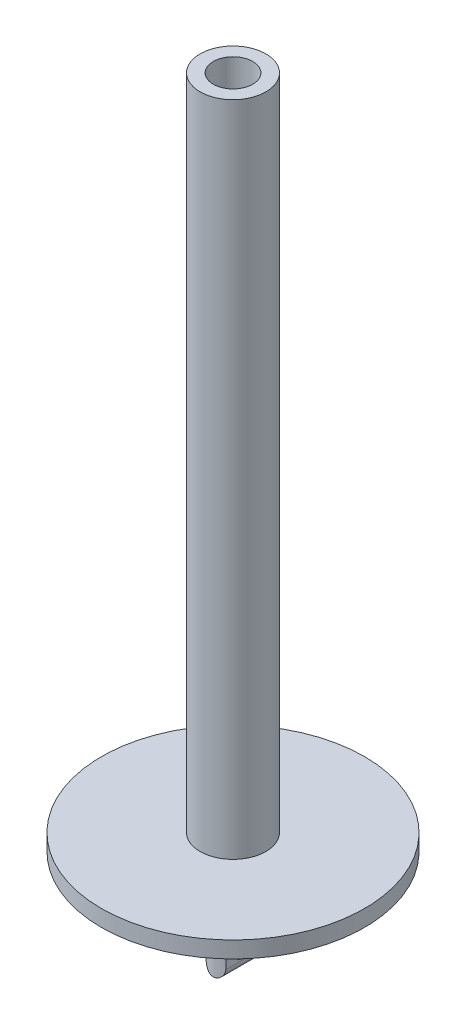
ISO-10303-21;
HEADER;
FILE_DESCRIPTION(('STEP AP214'),'2;1');
FILE_NAME('part.step','',(''),(''),'','','');
FILE_SCHEMA(('AUTOMOTIVE_DESIGN { 1 0 10303 214 1 1 1 1 }'));
ENDSEC;
DATA;
#1=APPLICATION_CONTEXT('core data for automotive mechanical design processes');
#2=APPLICATION_PROTOCOL_DEFINITION('international standard','automotive_design',2000,#1);
#3=PRODUCT_CONTEXT('',#1,'mechanical');
#4=PRODUCT('Part','Part','',(#3));
#5=PRODUCT_RELATED_PRODUCT_CATEGORY('part','',(#4));
#6=PRODUCT_DEFINITION_FORMATION('','',#4);
#7=PRODUCT_DEFINITION_CONTEXT('part definition',#1,'design');
#8=PRODUCT_DEFINITION('design','',#6,#7);
#9=PRODUCT_DEFINITION_SHAPE('','',#8);
#10=(LENGTH_UNIT() NAMED_UNIT(*) SI_UNIT(.MILLI.,.METRE.));
#11=(NAMED_UNIT(*) PLANE_ANGLE_UNIT() SI_UNIT($,.RADIAN.));
#12=(NAMED_UNIT(*) SI_UNIT($,.STERADIAN.) SOLID_ANGLE_UNIT());
#13=UNCERTAINTY_MEASURE_WITH_UNIT(LENGTH_MEASURE(1.E-05),#10,'distance_accuracy_value','');
#14=(GEOMETRIC_REPRESENTATION_CONTEXT(3) GLOBAL_UNCERTAINTY_ASSIGNED_CONTEXT((#13)) GLOBAL_UNIT_ASSIGNED_CONTEXT((#10,
#11,#12)) REPRESENTATION_CONTEXT('',''));
#15=CARTESIAN_POINT('',(0.,0.,0.));
#16=DIRECTION('',(0.,0.,1.));
#17=DIRECTION('',(1.,0.,0.));
#18=AXIS2_PLACEMENT_3D('',#15,#16,#17);
#19=CARTESIAN_POINT('',(3.,0.,-40.));
#20=DIRECTION('',(-1.,0.,0.));
#21=DIRECTION('',(0.,0.,1.));
#22=AXIS2_PLACEMENT_3D('',#19,#20,#21);
#23=PLANE('',#22);
#24=DIRECTION('',(0.,-1.,0.));
#25=VECTOR('',#24,1.);
#26=CARTESIAN_POINT('',(3.,30.,5.19615242270663));
#27=LINE('',#26,#25);
#28=CARTESIAN_POINT('',(3.,3.,5.19615242270663));
#29=VERTEX_POINT('',#28);
#30=CARTESIAN_POINT('',(3.,10.,5.19615242270663));
#31=VERTEX_POINT('',#30);
#32=EDGE_CURVE('E108',#29,#31,#27,.F.);
#33=ORIENTED_EDGE('',*,*,#32,.F.);
#34=DIRECTION('',(0.,0.,1.));
#35=VECTOR('',#34,1.);
#36=CARTESIAN_POINT('',(3.,3.,-40.));
#37=LINE('',#36,#35);
#38=CARTESIAN_POINT('',(3.,3.,-5.19615242270663));
#39=VERTEX_POINT('',#38);
#40=EDGE_CURVE('E103',#29,#39,#37,.F.);
#41=ORIENTED_EDGE('',*,*,#40,.T.);
#42=DIRECTION('',(0.,-1.,0.));
#43=VECTOR('',#42,1.);
#44=CARTESIAN_POINT('',(3.,30.,-5.19615242270663));
#45=LINE('',#44,#43);
#46=CARTESIAN_POINT('',(3.,10.,-5.19615242270663));
#47=VERTEX_POINT('',#46);
#48=EDGE_CURVE('E110',#47,#39,#45,.T.);
#49=ORIENTED_EDGE('',*,*,#48,.F.);
#50=DIRECTION('',(0.,0.,1.));
#51=VECTOR('',#50,1.);
#52=CARTESIAN_POINT('',(3.,10.,5.19615242270664));
#53=LINE('',#52,#51);
#54=EDGE_CURVE('E347',#47,#31,#53,.T.);
#55=ORIENTED_EDGE('',*,*,#54,.T.);
#56=EDGE_LOOP('',(#33,#41,#49,#55));
#57=FACE_BOUND('',#56,.T.);
#58=CARTESIAN_POINT('',(3.,6.05879050541191,0.));
#59=DIRECTION('',(-1.,0.,0.));
#60=DIRECTION('',(0.,0.,1.));
#61=AXIS2_PLACEMENT_3D('',#58,#59,#60);
#62=CIRCLE('',#61,2.64575131106459);
#63=CARTESIAN_POINT('',(3.,6.05879050541191,2.64575131106459));
#64=VERTEX_POINT('',#63);
#65=EDGE_CURVE('E112',#64,#64,#62,.F.);
#66=ORIENTED_EDGE('',*,*,#65,.F.);
#67=EDGE_LOOP('',(#66));
#68=FACE_BOUND('',#67,.T.);
#69=ADVANCED_FACE('F37',(#57,#68),#23,.F.);
#70=CARTESIAN_POINT('',(-3.,0.,-40.));
#71=DIRECTION('',(-1.,0.,0.));
#72=DIRECTION('',(0.,0.,1.));
#73=AXIS2_PLACEMENT_3D('',#70,#71,#72);
#74=PLANE('',#73);
#75=DIRECTION('',(0.,-1.,0.));
#76=VECTOR('',#75,1.);
#77=CARTESIAN_POINT('',(-3.,30.,-5.19615242270663));
#78=LINE('',#77,#76);
#79=CARTESIAN_POINT('',(-3.,10.,-5.19615242270663));
#80=VERTEX_POINT('',#79);
#81=CARTESIAN_POINT('',(-3.,3.,-5.19615242270663));
#82=VERTEX_POINT('',#81);
#83=EDGE_CURVE('E98',#80,#82,#78,.T.);
#84=ORIENTED_EDGE('',*,*,#83,.T.);
#85=DIRECTION('',(0.,0.,1.));
#86=VECTOR('',#85,1.);
#87=CARTESIAN_POINT('',(-3.,3.,5.19615242270664));
#88=LINE('',#87,#86);
#89=CARTESIAN_POINT('',(-3.,3.,5.19615242270663));
#90=VERTEX_POINT('',#89);
#91=EDGE_CURVE('E102',#82,#90,#88,.T.);
#92=ORIENTED_EDGE('',*,*,#91,.T.);
#93=DIRECTION('',(0.,-1.,0.));
#94=VECTOR('',#93,1.);
#95=CARTESIAN_POINT('',(-3.,30.,5.19615242270663));
#96=LINE('',#95,#94);
#97=CARTESIAN_POINT('',(-3.,10.,5.19615242270663));
#98=VERTEX_POINT('',#97);
#99=EDGE_CURVE('E101',#90,#98,#96,.F.);
#100=ORIENTED_EDGE('',*,*,#99,.T.);
#101=DIRECTION('',(0.,0.,1.));
#102=VECTOR('',#101,1.);
#103=CARTESIAN_POINT('',(-3.,10.,-5.19615242270664));
#104=LINE('',#103,#102);
#105=EDGE_CURVE('E90',#98,#80,#104,.F.);
#106=ORIENTED_EDGE('',*,*,#105,.T.);
#107=EDGE_LOOP('',(#84,#92,#100,#106));
#108=FACE_BOUND('',#107,.T.);
#109=CARTESIAN_POINT('',(-3.,6.05879050541191,0.));
#110=DIRECTION('',(-1.,0.,0.));
#111=DIRECTION('',(0.,0.,1.));
#112=AXIS2_PLACEMENT_3D('',#109,#110,#111);
#113=CIRCLE('',#112,2.64575131106459);
#114=CARTESIAN_POINT('',(-3.,6.05879050541191,2.64575131106459));
#115=VERTEX_POINT('',#114);
#116=EDGE_CURVE('E139',#115,#115,#113,.F.);
#117=ORIENTED_EDGE('',*,*,#116,.T.);
#118=EDGE_LOOP('',(#117));
#119=FACE_BOUND('',#118,.T.);
#120=ADVANCED_FACE('F96',(#108,#119),#74,.T.);
#121=CARTESIAN_POINT('',(0.,30.,0.));
#122=DIRECTION('',(0.,-1.,0.));
#123=DIRECTION('',(0.,0.,-1.));
#124=AXIS2_PLACEMENT_3D('',#121,#122,#123);
#125=CYLINDRICAL_SURFACE('',#124,6.);
#126=CARTESIAN_POINT('',(0.,30.,0.));
#127=DIRECTION('',(0.,1.,0.));
#128=DIRECTION('',(0.,0.,1.));
#129=AXIS2_PLACEMENT_3D('',#126,#127,#128);
#130=CIRCLE('',#129,6.);
#131=CARTESIAN_POINT('',(0.,30.,6.));
#132=VERTEX_POINT('',#131);
#133=EDGE_CURVE('E134',#132,#132,#130,.T.);
#134=ORIENTED_EDGE('',*,*,#133,.F.);
#135=EDGE_LOOP('',(#134));
#136=FACE_BOUND('',#135,.T.);
#137=CARTESIAN_POINT('',(-3.,3.,5.19615242270663));
#138=CARTESIAN_POINT('',(-3.00001416112556,2.92142977712134,5.19612931034574));
#139=CARTESIAN_POINT('',(-2.99691384901485,2.84287239374402,5.19793390420736));
#140=CARTESIAN_POINT('',(-2.98459572579975,2.68644380965166,5.20502448059779));
#141=CARTESIAN_POINT('',(-2.97538167436595,2.6085722170092,5.21030832353205));
#142=CARTESIAN_POINT('',(-2.95101831283099,2.45452685692729,5.22414342692725));
#143=CARTESIAN_POINT('',(-2.93590382742481,2.3783458498543,5.23267550890668));
#144=CARTESIAN_POINT('',(-2.89993893182426,2.2277605777854,5.25269235782276));
#145=CARTESIAN_POINT('',(-2.87908786319547,2.15335651781026,5.26417746369214));
#146=CARTESIAN_POINT('',(-2.80835726210526,1.93384624128959,5.30245403488438));
#147=CARTESIAN_POINT('',(-2.75022557368478,1.79197926884008,5.33311200198184));
#148=CARTESIAN_POINT('',(-2.61391787192868,1.51990515636659,5.40122379570303));
#149=CARTESIAN_POINT('',(-2.53570996471354,1.38971701803779,5.43868840769853));
#150=CARTESIAN_POINT('',(-2.35399236544455,1.13307712126213,5.5199095780929));
#151=CARTESIAN_POINT('',(-2.24893697621108,1.00780075657634,5.56393012402905));
#152=CARTESIAN_POINT('',(-2.01973708098548,0.775752658580963,5.65116781543943));
#153=CARTESIAN_POINT('',(-1.89558670608673,0.668986636020071,5.69438470931546));
#154=CARTESIAN_POINT('',(-1.62140501979867,0.469851936809155,5.77866433997553));
#155=CARTESIAN_POINT('',(-1.47018786898948,0.378955988501522,5.81938075284631));
#156=CARTESIAN_POINT('',(-1.15231019637523,0.22451696797019,5.89055110845483));
#157=CARTESIAN_POINT('',(-0.985674046577877,0.160931595559343,5.92102090573323));
#158=CARTESIAN_POINT('',(-0.682496705418511,0.0754782562706756,5.96253320812978));
#159=CARTESIAN_POINT('',(-0.548116980675108,0.0473105651936058,5.97646172660786));
#160=CARTESIAN_POINT('',(-0.344050938155642,0.0189978799117551,5.99051854145957));
#161=CARTESIAN_POINT('',(-0.275506891819651,0.0118833044338569,5.99406498252182));
#162=CARTESIAN_POINT('',(-0.137983157543604,0.00238148736730042,5.99880898456587));
#163=CARTESIAN_POINT('',(-0.0690033020229627,-3.80870741189172E-06,6.00000557887423));
#164=CARTESIAN_POINT('',(0.,0.,6.));
#165=B_SPLINE_CURVE_WITH_KNOTS('',3,(#137,#138,#139,#140,#141,#142,#143,#144,#145,#146,#147,
#148,#149,#150,#151,#152,#153,#154,#155,#156,#157,#158,#159,#160,#161,#162,#163,#164),
.UNSPECIFIED.,.F.,.F.,(4,2,2,2,2,2,2,2,2,2,2,2,2,4),(0.,0.235607761405842,0.471070768909938,
0.705164574619365,0.939285260400811,1.40613190719666,1.87372484513373,2.37954143591813,
2.88551380291461,3.42589268861168,3.9654315595503,4.37782938253258,4.58465718370427,
4.79157005131361),.UNSPECIFIED.);
#166=CARTESIAN_POINT('',(0.,0.,6.));
#167=VERTEX_POINT('',#166);
#168=EDGE_CURVE('E170',#90,#167,#165,.T.);
#169=ORIENTED_EDGE('',*,*,#168,.T.);
#170=CARTESIAN_POINT('',(0.,0.,6.));
#171=CARTESIAN_POINT('',(0.0791960106483574,-1.27282379261576E-05,6.0000140594507));
#172=CARTESIAN_POINT('',(0.158383010685805,0.00313564421146051,5.99843237172372));
#173=CARTESIAN_POINT('',(0.316109959438249,0.0156557456141286,5.99218297771194));
#174=CARTESIAN_POINT('',(0.394650155251105,0.0250249746152732,5.9875165110989));
#175=CARTESIAN_POINT('',(0.55016249658443,0.0498312166450842,5.9752310453278));
#176=CARTESIAN_POINT('',(0.627140171951955,0.0652402740929492,5.96762565136914));
#177=CARTESIAN_POINT('',(0.779335920625219,0.101936652809919,5.94966535802401));
#178=CARTESIAN_POINT('',(0.854553884723116,0.123224337863012,5.93931028848236));
#179=CARTESIAN_POINT('',(1.07663231109665,0.195534463416813,5.90450774124118));
#180=CARTESIAN_POINT('',(1.22023983061198,0.255056381989625,5.87629590491843));
#181=CARTESIAN_POINT('',(1.49529745921868,0.394629854070973,5.81241049916913));
#182=CARTESIAN_POINT('',(1.62673510823897,0.474702138509434,5.7767294015936));
#183=CARTESIAN_POINT('',(1.88251354230483,0.65854778576639,5.69868921598229));
#184=CARTESIAN_POINT('',(2.00595776812265,0.763453454990573,5.65605815545012));
#185=CARTESIAN_POINT('',(2.23433511185515,0.991559343641257,5.56980111432287));
#186=CARTESIAN_POINT('',(2.33925321751554,1.1147742520538,5.52617435891754));
#187=CARTESIAN_POINT('',(2.53582873358228,1.38755008854517,5.43893583467148));
#188=CARTESIAN_POINT('',(2.62580454466011,1.53841850372438,5.39559272061573));
#189=CARTESIAN_POINT('',(2.77859765513491,1.85535102967977,5.31853051041343));
#190=CARTESIAN_POINT('',(2.84147313039565,2.02138165336414,5.28479085213339));
#191=CARTESIAN_POINT('',(2.92569052169531,2.32282127951254,5.23851644730862));
#192=CARTESIAN_POINT('',(2.95338938743785,2.4559702436247,5.22283128805084));
#193=CARTESIAN_POINT('',(2.98126633638745,2.65835080219701,5.20693350370375));
#194=CARTESIAN_POINT('',(2.98828034647911,2.72639889556733,5.20290552345677));
#195=CARTESIAN_POINT('',(2.99765071779178,2.86295612400467,5.19750933846653));
#196=CARTESIAN_POINT('',(3.0000045610516,2.93146548825664,5.19614257162515));
#197=CARTESIAN_POINT('',(3.,3.,5.19615242270663));
#198=B_SPLINE_CURVE_WITH_KNOTS('',3,(#170,#171,#172,#173,#174,#175,#176,#177,#178,#179,#180,
#181,#182,#183,#184,#185,#186,#187,#188,#189,#190,#191,#192,#193,#194,#195,#196,#197),
.UNSPECIFIED.,.F.,.F.,(4,2,2,2,2,2,2,2,2,2,2,2,2,4),(0.,0.237494710163877,0.474894036944305,
0.711207286300498,0.947535162582146,1.41921975040767,1.89138205047105,2.39182392627191,
2.89266948206466,3.43273201282354,3.97162935474286,4.38068926568339,4.58607977159666,
4.79158122296549),.UNSPECIFIED.);
#199=EDGE_CURVE('E176',#167,#29,#198,.T.);
#200=ORIENTED_EDGE('',*,*,#199,.T.);
#201=ORIENTED_EDGE('',*,*,#32,.T.);
#202=CARTESIAN_POINT('',(3.,10.,5.19615242270663));
#203=CARTESIAN_POINT('',(2.99998855634961,10.0734971534515,5.19614727058185));
#204=CARTESIAN_POINT('',(3.00270073304931,10.1469909748139,5.19459284208687));
#205=CARTESIAN_POINT('',(3.01348648585434,10.2934458571304,5.18834948457229));
#206=CARTESIAN_POINT('',(3.02155973852755,10.3664069499553,5.18366074464466));
#207=CARTESIAN_POINT('',(3.04296726274993,10.5111808165174,5.1711213521685));
#208=CARTESIAN_POINT('',(3.05629436857776,10.5829950162651,5.16327500597159));
#209=CARTESIAN_POINT('',(3.08802088629775,10.725040214695,5.14436245617635));
#210=CARTESIAN_POINT('',(3.10642022335275,10.7952712367192,5.1332963000839));
#211=CARTESIAN_POINT('',(3.16892512691181,11.0029176557417,5.09512848452164));
#212=CARTESIAN_POINT('',(3.22034511612195,11.1373361752989,5.06305333927536));
#213=CARTESIAN_POINT('',(3.33980141206275,11.3940654487803,4.98505481886459));
#214=CARTESIAN_POINT('',(3.407832060108,11.5163803061104,4.93913615846608));
#215=CARTESIAN_POINT('',(3.55711267603632,11.7467805848507,4.83273903153675));
#216=CARTESIAN_POINT('',(3.63843632512209,11.854780244322,4.77217845526633));
#217=CARTESIAN_POINT('',(3.80941530073018,12.0539209719727,4.63683350909501));
#218=CARTESIAN_POINT('',(3.89907347367349,12.1450562485844,4.56204427060252));
#219=CARTESIAN_POINT('',(4.08763234357611,12.3151600247396,4.39410359393878));
#220=CARTESIAN_POINT('',(4.18676186254814,12.3930293168599,4.30010330843459));
#221=CARTESIAN_POINT('',(4.38407293308617,12.530468019899,4.09875321533317));
#222=CARTESIAN_POINT('',(4.48225409905746,12.5900302675192,3.9913982052345));
#223=CARTESIAN_POINT('',(4.64991637711479,12.68029030532,3.7935091981018));
#224=CARTESIAN_POINT('',(4.72046752907739,12.7144828463839,3.70542280295105));
#225=CARTESIAN_POINT('',(4.85766673278955,12.7750131552915,3.52363965739661));
#226=CARTESIAN_POINT('',(4.924313160875,12.8013476739782,3.42994060543045));
#227=CARTESIAN_POINT('',(5.05291225151321,12.84740289641,3.23751566947512));
#228=CARTESIAN_POINT('',(5.11485358623195,12.8671080072312,3.13877855455691));
#229=CARTESIAN_POINT('',(5.2332459150441,12.9010134152079,2.93714415036579));
#230=CARTESIAN_POINT('',(5.28969544909479,12.9152122514524,2.83424576502071));
#231=CARTESIAN_POINT('',(5.41477523740996,12.9432819960781,2.589395915796));
#232=CARTESIAN_POINT('',(5.48104472067091,12.9554089249379,2.44603393777749));
#233=CARTESIAN_POINT('',(5.60218050259488,12.9741377702466,2.1541963465119));
#234=CARTESIAN_POINT('',(5.65704220546624,12.9807374631966,2.00571870031414));
#235=CARTESIAN_POINT('',(5.75486416835817,12.9903718044965,1.70485981541493));
#236=CARTESIAN_POINT('',(5.79782957962929,12.9934079977392,1.55248029760032));
#237=CARTESIAN_POINT('',(5.87157202823355,12.9974771375024,1.24485166588072));
#238=CARTESIAN_POINT('',(5.90235410439174,12.9985109128799,1.08960376615563));
#239=CARTESIAN_POINT('',(5.95128675978419,12.9997037386776,0.77887194528596));
#240=CARTESIAN_POINT('',(5.96957334075449,12.9998723415739,0.623409644297099));
#241=CARTESIAN_POINT('',(5.98783647536976,12.9999805539456,0.389746462428567));
#242=CARTESIAN_POINT('',(5.99239639796487,12.9999925851803,0.311879159186039));
#243=CARTESIAN_POINT('',(5.99847843045637,13.0000004756187,0.156010623581011));
#244=CARTESIAN_POINT('',(5.99999994131478,12.9999963316338,0.0780093678424383));
#245=CARTESIAN_POINT('',(6.,13.,0.));
#246=B_SPLINE_CURVE_WITH_KNOTS('',3,(#202,#203,#204,#205,#206,#207,#208,#209,#210,#211,#212,
#213,#214,#215,#216,#217,#218,#219,#220,#221,#222,#223,#224,#225,#226,#227,#228,#229,#230,#231,
#232,#233,#234,#235,#236,#237,#238,#239,#240,#241,#242,#243,#244,#245),.UNSPECIFIED.,.F.,.F.,(4,
2,2,2,2,2,2,2,2,2,2,2,2,2,2,2,2,2,2,2,2,4),(0.,0.220419027708138,0.440824758809851,
0.660930913200454,0.881033820254863,1.32109004478215,1.76099656580169,2.20342969770915,
2.64601448919641,3.11593653327293,3.58604221808362,3.93934967363892,4.29280301394736,
4.64708198701743,5.00145489229252,5.47599820849951,5.95073233262576,6.42526056800537,
6.89959234079499,7.36867551335446,7.60262645757848,7.8366235218419),.UNSPECIFIED.);
#247=CARTESIAN_POINT('',(6.,13.,0.));
#248=VERTEX_POINT('',#247);
#249=EDGE_CURVE('E47',#31,#248,#246,.T.);
#250=ORIENTED_EDGE('',*,*,#249,.T.);
#251=CARTESIAN_POINT('',(6.,13.,0.));
#252=CARTESIAN_POINT('',(5.99999989331859,12.9999950935085,-0.0838873332919608));
#253=CARTESIAN_POINT('',(5.99824044415848,13.0000006345147,-0.167764490462392));
#254=CARTESIAN_POINT('',(5.99120725666577,12.9999900862199,-0.335369516653051));
#255=CARTESIAN_POINT('',(5.98593359402302,12.9999739973846,-0.419097388849668));
#256=CARTESIAN_POINT('',(5.96484570549239,12.9998294885247,-0.669893604781263));
#257=CARTESIAN_POINT('',(5.94376458143691,12.9996048026561,-0.836549888060214));
#258=CARTESIAN_POINT('',(5.88754869614817,12.998023458115,-1.16845066695463));
#259=CARTESIAN_POINT('',(5.85233249459784,12.9966601893452,-1.33368121287875));
#260=CARTESIAN_POINT('',(5.76811212020374,12.991322586002,-1.66052435187971));
#261=CARTESIAN_POINT('',(5.71911176509812,12.9873489739979,-1.82213793337066));
#262=CARTESIAN_POINT('',(5.61823550521918,12.9759560911892,-2.11049001034281));
#263=CARTESIAN_POINT('',(5.56864117508788,12.9693271573087,-2.23806186777762));
#264=CARTESIAN_POINT('',(5.46097473392174,12.9516824455779,-2.4892600911821));
#265=CARTESIAN_POINT('',(5.4029041915716,12.9406674787963,-2.61288718205818));
#266=CARTESIAN_POINT('',(5.27894789365744,12.9127491400021,-2.85502249069464));
#267=CARTESIAN_POINT('',(5.21308576533554,12.8958632835387,-2.97354476930839));
#268=CARTESIAN_POINT('',(5.07413862675034,12.8544758129297,-3.20488661116344));
#269=CARTESIAN_POINT('',(5.0010562888324,12.8299770093405,-3.31770826112764));
#270=CARTESIAN_POINT('',(4.87040320540141,12.7798229732741,-3.50546629927594));
#271=CARTESIAN_POINT('',(4.81432306006866,12.7564729324048,-3.58206098492559));
#272=CARTESIAN_POINT('',(4.69958618848578,12.7042369826769,-3.73131927411414));
#273=CARTESIAN_POINT('',(4.64093016724524,12.6753525813668,-3.80398394128617));
#274=CARTESIAN_POINT('',(4.52177953075074,12.6114029224246,-3.94487087796069));
#275=CARTESIAN_POINT('',(4.46128651157606,12.5763429101223,-4.01309685070994));
#276=CARTESIAN_POINT('',(4.33933606137456,12.4994805774305,-4.14466278789614));
#277=CARTESIAN_POINT('',(4.27787879098078,12.457679369503,-4.20800355596618));
#278=CARTESIAN_POINT('',(4.11400350027447,12.3364858309065,-4.36984695224763));
#279=CARTESIAN_POINT('',(4.01155728680159,12.2505954186082,-4.46368191689363));
#280=CARTESIAN_POINT('',(3.86249353379689,12.1061541130182,-4.59189568165987));
#281=CARTESIAN_POINT('',(3.81355412530472,12.0553820852061,-4.63255789459335));
#282=CARTESIAN_POINT('',(3.71797271160104,11.9487092725866,-4.70961013664534));
#283=CARTESIAN_POINT('',(3.67132963601362,11.8928109127457,-4.74600216735413));
#284=CARTESIAN_POINT('',(3.580898929284,11.7757946200755,-4.81460351359217));
#285=CARTESIAN_POINT('',(3.53712656215981,11.7146522387256,-4.84679125120606));
#286=CARTESIAN_POINT('',(3.45347139146895,11.5877546318918,-4.90674863203719));
#287=CARTESIAN_POINT('',(3.41358698131704,11.5220013312141,-4.93452010316885));
#288=CARTESIAN_POINT('',(3.33836375446891,11.3862591314093,-4.98571987719041));
#289=CARTESIAN_POINT('',(3.30302816858539,11.3162672731536,-5.00914509830053));
#290=CARTESIAN_POINT('',(3.23755920079098,11.1726709997491,-5.05170560460512));
#291=CARTESIAN_POINT('',(3.20742524284124,11.0990669857786,-5.07084136489338));
#292=CARTESIAN_POINT('',(3.13019047756496,10.8863215186018,-5.11912357973039));
#293=CARTESIAN_POINT('',(3.08979505779549,10.7435388035217,-5.14337747069473));
#294=CARTESIAN_POINT('',(3.03057397460812,10.4522621091838,-5.17849652632619));
#295=CARTESIAN_POINT('',(3.01169920449003,10.3037819348076,-5.18939217667203));
#296=CARTESIAN_POINT('',(3.00266212032441,10.1289910167355,-5.19461403102124));
#297=CARTESIAN_POINT('',(3.00166348529291,10.1031900189232,-5.19519138684864));
#298=CARTESIAN_POINT('',(3.00033338134405,10.0515950603069,-5.19596031096362));
#299=CARTESIAN_POINT('',(3.00000113897402,10.0258011261281,-5.19615232649889));
#300=CARTESIAN_POINT('',(3.,10.,-5.19615242270674));
#301=B_SPLINE_CURVE_WITH_KNOTS('',3,(#251,#252,#253,#254,#255,#256,#257,#258,#259,#260,#261,
#262,#263,#264,#265,#266,#267,#268,#269,#270,#271,#272,#273,#274,#275,#276,#277,#278,#279,#280,
#281,#282,#283,#284,#285,#286,#287,#288,#289,#290,#291,#292,#293,#294,#295,#296,#297,#298,#299,
#300),.UNSPECIFIED.,.F.,.F.,(4,2,2,2,2,2,2,2,2,2,2,2,2,2,2,2,2,2,2,2,2,2,2,2,4),(0.,
0.251623229279499,0.503241039220382,1.00655040355401,1.51280223168704,2.01891398323024,
2.4296606429254,2.84033138227507,3.24978727010162,3.65909217377697,3.95213302434629,
4.2450941643711,4.53780766371776,4.83047290751616,5.3179954071499,5.56195643001223,
5.80580263872116,6.05085490814209,6.29580548372939,6.54092908724705,6.7860255278388,
7.23476382514672,7.68247611081539,7.75995221993146,7.83733835377714),.UNSPECIFIED.);
#302=EDGE_CURVE('E11',#248,#47,#301,.T.);
#303=ORIENTED_EDGE('',*,*,#302,.T.);
#304=ORIENTED_EDGE('',*,*,#48,.T.);
#305=CARTESIAN_POINT('',(3.,3.,-5.19615242270663));
#306=CARTESIAN_POINT('',(3.00001416112556,2.92142977712134,-5.19612931034574));
#307=CARTESIAN_POINT('',(2.99691384901485,2.84287239374402,-5.19793390420736));
#308=CARTESIAN_POINT('',(2.98459572579975,2.68644380965166,-5.20502448059779));
#309=CARTESIAN_POINT('',(2.97538167436595,2.6085722170092,-5.21030832353205));
#310=CARTESIAN_POINT('',(2.95101831283099,2.45452685692729,-5.22414342692725));
#311=CARTESIAN_POINT('',(2.93590382742481,2.3783458498543,-5.23267550890668));
#312=CARTESIAN_POINT('',(2.89993893182426,2.2277605777854,-5.25269235782276));
#313=CARTESIAN_POINT('',(2.87908786319547,2.15335651781026,-5.26417746369214));
#314=CARTESIAN_POINT('',(2.80835726210526,1.93384624128959,-5.30245403488438));
#315=CARTESIAN_POINT('',(2.75022557368478,1.79197926884008,-5.33311200198184));
#316=CARTESIAN_POINT('',(2.61391787192868,1.51990515636659,-5.40122379570303));
#317=CARTESIAN_POINT('',(2.53570996471354,1.38971701803779,-5.43868840769853));
#318=CARTESIAN_POINT('',(2.35399236544455,1.13307712126213,-5.5199095780929));
#319=CARTESIAN_POINT('',(2.24893697621108,1.00780075657634,-5.56393012402905));
#320=CARTESIAN_POINT('',(2.01973708098548,0.775752658580963,-5.65116781543943));
#321=CARTESIAN_POINT('',(1.89558670608673,0.668986636020071,-5.69438470931546));
#322=CARTESIAN_POINT('',(1.62140501979867,0.469851936809155,-5.77866433997553));
#323=CARTESIAN_POINT('',(1.47018786898948,0.378955988501522,-5.81938075284631));
#324=CARTESIAN_POINT('',(1.15231019637523,0.22451696797019,-5.89055110845483));
#325=CARTESIAN_POINT('',(0.985674046577877,0.160931595559343,-5.92102090573323));
#326=CARTESIAN_POINT('',(0.682496705418511,0.0754782562706756,-5.96253320812978));
#327=CARTESIAN_POINT('',(0.548116980675108,0.0473105651936058,-5.97646172660786));
#328=CARTESIAN_POINT('',(0.344050938155642,0.0189978799117551,-5.99051854145957));
#329=CARTESIAN_POINT('',(0.275506891819651,0.0118833044338569,-5.99406498252182));
#330=CARTESIAN_POINT('',(0.137983157543604,0.00238148736730042,-5.99880898456587));
#331=CARTESIAN_POINT('',(0.0690033020229627,-3.80870741189172E-06,-6.00000557887423));
#332=CARTESIAN_POINT('',(0.,0.,-6.));
#333=B_SPLINE_CURVE_WITH_KNOTS('',3,(#305,#306,#307,#308,#309,#310,#311,#312,#313,#314,#315,
#316,#317,#318,#319,#320,#321,#322,#323,#324,#325,#326,#327,#328,#329,#330,#331,#332),
.UNSPECIFIED.,.F.,.F.,(4,2,2,2,2,2,2,2,2,2,2,2,2,4),(0.,0.235607761405842,0.471070768909938,
0.705164574619365,0.939285260400811,1.40613190719666,1.87372484513373,2.37954143591813,
2.88551380291461,3.42589268861168,3.9654315595503,4.37782938253258,4.58465718370427,
4.79157005131361),.UNSPECIFIED.);
#334=CARTESIAN_POINT('',(0.,0.,-6.));
#335=VERTEX_POINT('',#334);
#336=EDGE_CURVE('E148',#39,#335,#333,.T.);
#337=ORIENTED_EDGE('',*,*,#336,.T.);
#338=CARTESIAN_POINT('',(0.,0.,-6.));
#339=CARTESIAN_POINT('',(-0.0791960106483574,-1.27282379261576E-05,-6.0000140594507));
#340=CARTESIAN_POINT('',(-0.158383010685805,0.00313564421146051,-5.99843237172372));
#341=CARTESIAN_POINT('',(-0.316109959438249,0.0156557456141286,-5.99218297771194));
#342=CARTESIAN_POINT('',(-0.394650155251105,0.0250249746152732,-5.9875165110989));
#343=CARTESIAN_POINT('',(-0.55016249658443,0.0498312166450842,-5.9752310453278));
#344=CARTESIAN_POINT('',(-0.627140171951955,0.0652402740929492,-5.96762565136914));
#345=CARTESIAN_POINT('',(-0.779335920625219,0.101936652809919,-5.94966535802401));
#346=CARTESIAN_POINT('',(-0.854553884723116,0.123224337863012,-5.93931028848236));
#347=CARTESIAN_POINT('',(-1.07663231109665,0.195534463416813,-5.90450774124118));
#348=CARTESIAN_POINT('',(-1.22023983061198,0.255056381989625,-5.87629590491843));
#349=CARTESIAN_POINT('',(-1.49529745921868,0.394629854070973,-5.81241049916913));
#350=CARTESIAN_POINT('',(-1.62673510823897,0.474702138509434,-5.7767294015936));
#351=CARTESIAN_POINT('',(-1.88251354230483,0.65854778576639,-5.69868921598229));
#352=CARTESIAN_POINT('',(-2.00595776812265,0.763453454990573,-5.65605815545012));
#353=CARTESIAN_POINT('',(-2.23433511185515,0.991559343641257,-5.56980111432287));
#354=CARTESIAN_POINT('',(-2.33925321751554,1.1147742520538,-5.52617435891754));
#355=CARTESIAN_POINT('',(-2.53582873358228,1.38755008854517,-5.43893583467148));
#356=CARTESIAN_POINT('',(-2.62580454466011,1.53841850372438,-5.39559272061573));
#357=CARTESIAN_POINT('',(-2.77859765513491,1.85535102967977,-5.31853051041343));
#358=CARTESIAN_POINT('',(-2.84147313039565,2.02138165336414,-5.28479085213339));
#359=CARTESIAN_POINT('',(-2.92569052169531,2.32282127951254,-5.23851644730862));
#360=CARTESIAN_POINT('',(-2.95338938743785,2.4559702436247,-5.22283128805084));
#361=CARTESIAN_POINT('',(-2.98126633638745,2.65835080219701,-5.20693350370375));
#362=CARTESIAN_POINT('',(-2.98828034647911,2.72639889556733,-5.20290552345677));
#363=CARTESIAN_POINT('',(-2.99765071779178,2.86295612400467,-5.19750933846653));
#364=CARTESIAN_POINT('',(-3.0000045610516,2.93146548825664,-5.19614257162515));
#365=CARTESIAN_POINT('',(-3.,3.,-5.19615242270663));
#366=B_SPLINE_CURVE_WITH_KNOTS('',3,(#338,#339,#340,#341,#342,#343,#344,#345,#346,#347,#348,
#349,#350,#351,#352,#353,#354,#355,#356,#357,#358,#359,#360,#361,#362,#363,#364,#365),
.UNSPECIFIED.,.F.,.F.,(4,2,2,2,2,2,2,2,2,2,2,2,2,4),(0.,0.237494710163877,0.474894036944305,
0.711207286300498,0.947535162582146,1.41921975040767,1.89138205047105,2.39182392627191,
2.89266948206466,3.43273201282354,3.97162935474286,4.38068926568339,4.58607977159666,
4.79158122296549),.UNSPECIFIED.);
#367=EDGE_CURVE('E107',#335,#82,#366,.T.);
#368=ORIENTED_EDGE('',*,*,#367,.T.);
#369=ORIENTED_EDGE('',*,*,#83,.F.);
#370=CARTESIAN_POINT('',(-3.,10.,-5.19615242270663));
#371=CARTESIAN_POINT('',(-2.99998855634961,10.0734971534515,-5.19614727058185));
#372=CARTESIAN_POINT('',(-3.00270073304931,10.1469909748139,-5.19459284208687));
#373=CARTESIAN_POINT('',(-3.01348648585434,10.2934458571304,-5.18834948457229));
#374=CARTESIAN_POINT('',(-3.02155973852755,10.3664069499553,-5.18366074464466));
#375=CARTESIAN_POINT('',(-3.04296726274993,10.5111808165174,-5.1711213521685));
#376=CARTESIAN_POINT('',(-3.05629436857776,10.5829950162651,-5.16327500597159));
#377=CARTESIAN_POINT('',(-3.08802088629775,10.725040214695,-5.14436245617635));
#378=CARTESIAN_POINT('',(-3.10642022335275,10.7952712367192,-5.1332963000839));
#379=CARTESIAN_POINT('',(-3.16892512691181,11.0029176557417,-5.09512848452164));
#380=CARTESIAN_POINT('',(-3.22034511612195,11.1373361752989,-5.06305333927536));
#381=CARTESIAN_POINT('',(-3.33980141206275,11.3940654487803,-4.98505481886459));
#382=CARTESIAN_POINT('',(-3.407832060108,11.5163803061104,-4.93913615846608));
#383=CARTESIAN_POINT('',(-3.55711267603632,11.7467805848507,-4.83273903153675));
#384=CARTESIAN_POINT('',(-3.63843632512209,11.854780244322,-4.77217845526633));
#385=CARTESIAN_POINT('',(-3.80941530073018,12.0539209719727,-4.63683350909501));
#386=CARTESIAN_POINT('',(-3.89907347367349,12.1450562485844,-4.56204427060252));
#387=CARTESIAN_POINT('',(-4.08763234357611,12.3151600247396,-4.39410359393878));
#388=CARTESIAN_POINT('',(-4.18676186254814,12.3930293168599,-4.30010330843459));
#389=CARTESIAN_POINT('',(-4.38407293308617,12.530468019899,-4.09875321533317));
#390=CARTESIAN_POINT('',(-4.48225409905746,12.5900302675192,-3.9913982052345));
#391=CARTESIAN_POINT('',(-4.64991637711479,12.68029030532,-3.7935091981018));
#392=CARTESIAN_POINT('',(-4.72046752907739,12.7144828463839,-3.70542280295105));
#393=CARTESIAN_POINT('',(-4.85766673278955,12.7750131552915,-3.52363965739661));
#394=CARTESIAN_POINT('',(-4.924313160875,12.8013476739782,-3.42994060543045));
#395=CARTESIAN_POINT('',(-5.05291225151321,12.84740289641,-3.23751566947512));
#396=CARTESIAN_POINT('',(-5.11485358623195,12.8671080072312,-3.13877855455691));
#397=CARTESIAN_POINT('',(-5.2332459150441,12.9010134152079,-2.93714415036579));
#398=CARTESIAN_POINT('',(-5.28969544909479,12.9152122514524,-2.83424576502071));
#399=CARTESIAN_POINT('',(-5.41477523740996,12.9432819960781,-2.589395915796));
#400=CARTESIAN_POINT('',(-5.48104472067091,12.9554089249379,-2.44603393777749));
#401=CARTESIAN_POINT('',(-5.60218050259488,12.9741377702466,-2.1541963465119));
#402=CARTESIAN_POINT('',(-5.65704220546624,12.9807374631966,-2.00571870031414));
#403=CARTESIAN_POINT('',(-5.75486416835817,12.9903718044965,-1.70485981541493));
#404=CARTESIAN_POINT('',(-5.79782957962929,12.9934079977392,-1.55248029760032));
#405=CARTESIAN_POINT('',(-5.87157202823355,12.9974771375024,-1.24485166588072));
#406=CARTESIAN_POINT('',(-5.90235410439174,12.9985109128799,-1.08960376615563));
#407=CARTESIAN_POINT('',(-5.95128675978419,12.9997037386776,-0.77887194528596));
#408=CARTESIAN_POINT('',(-5.96957334075449,12.9998723415739,-0.623409644297099));
#409=CARTESIAN_POINT('',(-5.98783647536976,12.9999805539456,-0.389746462428567));
#410=CARTESIAN_POINT('',(-5.99239639796487,12.9999925851803,-0.311879159186039));
#411=CARTESIAN_POINT('',(-5.99847843045637,13.0000004756187,-0.156010623581011));
#412=CARTESIAN_POINT('',(-5.99999994131478,12.9999963316338,-0.0780093678424383));
#413=CARTESIAN_POINT('',(-6.,13.,0.));
#414=B_SPLINE_CURVE_WITH_KNOTS('',3,(#370,#371,#372,#373,#374,#375,#376,#377,#378,#379,#380,
#381,#382,#383,#384,#385,#386,#387,#388,#389,#390,#391,#392,#393,#394,#395,#396,#397,#398,#399,
#400,#401,#402,#403,#404,#405,#406,#407,#408,#409,#410,#411,#412,#413),.UNSPECIFIED.,.F.,.F.,(4,
2,2,2,2,2,2,2,2,2,2,2,2,2,2,2,2,2,2,2,2,4),(0.,0.220419027708138,0.440824758809851,
0.660930913200454,0.881033820254863,1.32109004478215,1.76099656580169,2.20342969770915,
2.64601448919641,3.11593653327293,3.58604221808362,3.93934967363892,4.29280301394736,
4.64708198701743,5.00145489229252,5.47599820849951,5.95073233262576,6.42526056800537,
6.89959234079499,7.36867551335446,7.60262645757848,7.8366235218419),.UNSPECIFIED.);
#415=CARTESIAN_POINT('',(-6.,13.,0.));
#416=VERTEX_POINT('',#415);
#417=EDGE_CURVE('E59',#80,#416,#414,.T.);
#418=ORIENTED_EDGE('',*,*,#417,.T.);
#419=CARTESIAN_POINT('',(-6.,13.,0.));
#420=CARTESIAN_POINT('',(-5.99999989331859,12.9999950935085,0.0838873332919608));
#421=CARTESIAN_POINT('',(-5.99824044415848,13.0000006345147,0.167764490462392));
#422=CARTESIAN_POINT('',(-5.99120725666577,12.9999900862199,0.335369516653051));
#423=CARTESIAN_POINT('',(-5.98593359402302,12.9999739973846,0.419097388849668));
#424=CARTESIAN_POINT('',(-5.96484570549239,12.9998294885247,0.669893604781263));
#425=CARTESIAN_POINT('',(-5.94376458143691,12.9996048026561,0.836549888060214));
#426=CARTESIAN_POINT('',(-5.88754869614817,12.998023458115,1.16845066695463));
#427=CARTESIAN_POINT('',(-5.85233249459784,12.9966601893452,1.33368121287875));
#428=CARTESIAN_POINT('',(-5.76811212020374,12.991322586002,1.66052435187971));
#429=CARTESIAN_POINT('',(-5.71911176509812,12.9873489739979,1.82213793337066));
#430=CARTESIAN_POINT('',(-5.61823550521918,12.9759560911892,2.11049001034281));
#431=CARTESIAN_POINT('',(-5.56864117508788,12.9693271573087,2.23806186777762));
#432=CARTESIAN_POINT('',(-5.46097473392174,12.9516824455779,2.4892600911821));
#433=CARTESIAN_POINT('',(-5.4029041915716,12.9406674787963,2.61288718205818));
#434=CARTESIAN_POINT('',(-5.27894789365744,12.9127491400021,2.85502249069464));
#435=CARTESIAN_POINT('',(-5.21308576533554,12.8958632835387,2.97354476930839));
#436=CARTESIAN_POINT('',(-5.07413862675034,12.8544758129297,3.20488661116344));
#437=CARTESIAN_POINT('',(-5.0010562888324,12.8299770093405,3.31770826112764));
#438=CARTESIAN_POINT('',(-4.87040320540141,12.7798229732741,3.50546629927594));
#439=CARTESIAN_POINT('',(-4.81432306006866,12.7564729324048,3.58206098492559));
#440=CARTESIAN_POINT('',(-4.69958618848578,12.7042369826769,3.73131927411414));
#441=CARTESIAN_POINT('',(-4.64093016724524,12.6753525813668,3.80398394128617));
#442=CARTESIAN_POINT('',(-4.52177953075074,12.6114029224246,3.94487087796069));
#443=CARTESIAN_POINT('',(-4.46128651157606,12.5763429101223,4.01309685070994));
#444=CARTESIAN_POINT('',(-4.33933606137456,12.4994805774305,4.14466278789614));
#445=CARTESIAN_POINT('',(-4.27787879098078,12.457679369503,4.20800355596618));
#446=CARTESIAN_POINT('',(-4.11400350027447,12.3364858309065,4.36984695224763));
#447=CARTESIAN_POINT('',(-4.01155728680159,12.2505954186082,4.46368191689363));
#448=CARTESIAN_POINT('',(-3.86249353379689,12.1061541130182,4.59189568165987));
#449=CARTESIAN_POINT('',(-3.81355412530472,12.0553820852061,4.63255789459335));
#450=CARTESIAN_POINT('',(-3.71797271160104,11.9487092725866,4.70961013664534));
#451=CARTESIAN_POINT('',(-3.67132963601362,11.8928109127457,4.74600216735413));
#452=CARTESIAN_POINT('',(-3.580898929284,11.7757946200755,4.81460351359217));
#453=CARTESIAN_POINT('',(-3.53712656215981,11.7146522387256,4.84679125120606));
#454=CARTESIAN_POINT('',(-3.45347139146895,11.5877546318918,4.90674863203719));
#455=CARTESIAN_POINT('',(-3.41358698131704,11.5220013312141,4.93452010316885));
#456=CARTESIAN_POINT('',(-3.33836375446891,11.3862591314093,4.98571987719041));
#457=CARTESIAN_POINT('',(-3.30302816858539,11.3162672731536,5.00914509830053));
#458=CARTESIAN_POINT('',(-3.23755920079098,11.1726709997491,5.05170560460512));
#459=CARTESIAN_POINT('',(-3.20742524284124,11.0990669857786,5.07084136489338));
#460=CARTESIAN_POINT('',(-3.13019047756496,10.8863215186018,5.11912357973039));
#461=CARTESIAN_POINT('',(-3.08979505779549,10.7435388035217,5.14337747069473));
#462=CARTESIAN_POINT('',(-3.03057397460812,10.4522621091838,5.17849652632619));
#463=CARTESIAN_POINT('',(-3.01169920449003,10.3037819348076,5.18939217667203));
#464=CARTESIAN_POINT('',(-3.00266212032441,10.1289910167355,5.19461403102124));
#465=CARTESIAN_POINT('',(-3.00166348529291,10.1031900189232,5.19519138684864));
#466=CARTESIAN_POINT('',(-3.00033338134405,10.0515950603069,5.19596031096362));
#467=CARTESIAN_POINT('',(-3.00000113897402,10.0258011261281,5.19615232649889));
#468=CARTESIAN_POINT('',(-3.,10.,5.19615242270674));
#469=B_SPLINE_CURVE_WITH_KNOTS('',3,(#419,#420,#421,#422,#423,#424,#425,#426,#427,#428,#429,
#430,#431,#432,#433,#434,#435,#436,#437,#438,#439,#440,#441,#442,#443,#444,#445,#446,#447,#448,
#449,#450,#451,#452,#453,#454,#455,#456,#457,#458,#459,#460,#461,#462,#463,#464,#465,#466,#467,
#468),.UNSPECIFIED.,.F.,.F.,(4,2,2,2,2,2,2,2,2,2,2,2,2,2,2,2,2,2,2,2,2,2,2,2,4),(0.,
0.251623229279499,0.503241039220382,1.00655040355401,1.51280223168704,2.01891398323024,
2.4296606429254,2.84033138227507,3.24978727010162,3.65909217377697,3.95213302434629,
4.2450941643711,4.53780766371776,4.83047290751616,5.3179954071499,5.56195643001223,
5.80580263872116,6.05085490814209,6.29580548372939,6.54092908724705,6.7860255278388,
7.23476382514672,7.68247611081539,7.75995221993146,7.83733835377714),.UNSPECIFIED.);
#470=EDGE_CURVE('E91',#416,#98,#469,.T.);
#471=ORIENTED_EDGE('',*,*,#470,.T.);
#472=ORIENTED_EDGE('',*,*,#99,.F.);
#473=EDGE_LOOP('',(#169,#200,#201,#250,#303,#304,#337,#368,#369,#418,#471,#472));
#474=FACE_BOUND('',#473,.T.);
#475=ADVANCED_FACE('F105',(#136,#474),#125,.T.);
#476=CARTESIAN_POINT('',(0.,35.,0.));
#477=DIRECTION('',(0.,1.,0.));
#478=DIRECTION('',(0.,0.,1.));
#479=AXIS2_PLACEMENT_3D('',#476,#477,#478);
#480=PLANE('',#479);
#481=CARTESIAN_POINT('',(0.,35.,0.));
#482=DIRECTION('',(0.,1.,0.));
#483=DIRECTION('',(0.,0.,1.));
#484=AXIS2_PLACEMENT_3D('',#481,#482,#483);
#485=CIRCLE('',#484,40.);
#486=CARTESIAN_POINT('',(0.,35.,40.));
#487=VERTEX_POINT('',#486);
#488=EDGE_CURVE('E131',#487,#487,#485,.T.);
#489=ORIENTED_EDGE('',*,*,#488,.T.);
#490=EDGE_LOOP('',(#489));
#491=FACE_BOUND('',#490,.T.);
#492=CARTESIAN_POINT('',(0.,35.,0.));
#493=DIRECTION('',(0.,1.,0.));
#494=DIRECTION('',(0.,0.,1.));
#495=AXIS2_PLACEMENT_3D('',#492,#493,#494);
#496=CIRCLE('',#495,10.);
#497=CARTESIAN_POINT('',(0.,35.,10.));
#498=VERTEX_POINT('',#497);
#499=EDGE_CURVE('E122',#498,#498,#496,.T.);
#500=ORIENTED_EDGE('',*,*,#499,.F.);
#501=EDGE_LOOP('',(#500));
#502=FACE_BOUND('',#501,.T.);
#503=ADVANCED_FACE('F159',(#491,#502),#480,.T.);
#504=CARTESIAN_POINT('',(0.,30.,0.));
#505=DIRECTION('',(0.,1.,0.));
#506=DIRECTION('',(0.,0.,1.));
#507=AXIS2_PLACEMENT_3D('',#504,#505,#506);
#508=PLANE('',#507);
#509=CARTESIAN_POINT('',(0.,30.,0.));
#510=DIRECTION('',(0.,1.,0.));
#511=DIRECTION('',(0.,0.,1.));
#512=AXIS2_PLACEMENT_3D('',#509,#510,#511);
#513=CIRCLE('',#512,40.);
#514=CARTESIAN_POINT('',(0.,30.,40.));
#515=VERTEX_POINT('',#514);
#516=EDGE_CURVE('E128',#515,#515,#513,.T.);
#517=ORIENTED_EDGE('',*,*,#516,.F.);
#518=EDGE_LOOP('',(#517));
#519=FACE_BOUND('',#518,.T.);
#520=ORIENTED_EDGE('',*,*,#133,.T.);
#521=EDGE_LOOP('',(#520));
#522=FACE_BOUND('',#521,.T.);
#523=ADVANCED_FACE('F235',(#519,#522),#508,.F.);
#524=CARTESIAN_POINT('',(0.,35.,0.));
#525=DIRECTION('',(0.,-1.,0.));
#526=DIRECTION('',(0.,0.,-1.));
#527=AXIS2_PLACEMENT_3D('',#524,#525,#526);
#528=CYLINDRICAL_SURFACE('',#527,40.);
#529=ORIENTED_EDGE('',*,*,#488,.F.);
#530=EDGE_LOOP('',(#529));
#531=FACE_BOUND('',#530,.T.);
#532=ORIENTED_EDGE('',*,*,#516,.T.);
#533=EDGE_LOOP('',(#532));
#534=FACE_BOUND('',#533,.T.);
#535=ADVANCED_FACE('F161',(#531,#534),#528,.T.);
#536=CARTESIAN_POINT('',(0.,235.,0.));
#537=DIRECTION('',(0.,-1.,0.));
#538=DIRECTION('',(0.,0.,-1.));
#539=AXIS2_PLACEMENT_3D('',#536,#537,#538);
#540=CYLINDRICAL_SURFACE('',#539,10.);
#541=CARTESIAN_POINT('',(0.,235.,0.));
#542=DIRECTION('',(0.,1.,0.));
#543=DIRECTION('',(0.,0.,1.));
#544=AXIS2_PLACEMENT_3D('',#541,#542,#543);
#545=CIRCLE('',#544,10.);
#546=CARTESIAN_POINT('',(0.,235.,10.));
#547=VERTEX_POINT('',#546);
#548=EDGE_CURVE('E125',#547,#547,#545,.T.);
#549=ORIENTED_EDGE('',*,*,#548,.F.);
#550=EDGE_LOOP('',(#549));
#551=FACE_BOUND('',#550,.T.);
#552=ORIENTED_EDGE('',*,*,#499,.T.);
#553=EDGE_LOOP('',(#552));
#554=FACE_BOUND('',#553,.T.);
#555=ADVANCED_FACE('F229',(#551,#554),#540,.T.);
#556=CARTESIAN_POINT('',(0.,235.,0.));
#557=DIRECTION('',(0.,1.,0.));
#558=DIRECTION('',(0.,0.,1.));
#559=AXIS2_PLACEMENT_3D('',#556,#557,#558);
#560=PLANE('',#559);
#561=CARTESIAN_POINT('',(0.,235.,0.));
#562=DIRECTION('',(0.,1.,0.));
#563=DIRECTION('',(0.,0.,1.));
#564=AXIS2_PLACEMENT_3D('',#561,#562,#563);
#565=CIRCLE('',#564,6.);
#566=CARTESIAN_POINT('',(0.,235.,6.));
#567=VERTEX_POINT('',#566);
#568=EDGE_CURVE('E118',#567,#567,#565,.T.);
#569=ORIENTED_EDGE('',*,*,#568,.F.);
#570=EDGE_LOOP('',(#569));
#571=FACE_BOUND('',#570,.T.);
#572=ORIENTED_EDGE('',*,*,#548,.T.);
#573=EDGE_LOOP('',(#572));
#574=FACE_BOUND('',#573,.T.);
#575=ADVANCED_FACE('F225',(#571,#574),#560,.T.);
#576=CARTESIAN_POINT('',(0.,75.,0.));
#577=DIRECTION('',(0.,1.,0.));
#578=DIRECTION('',(0.,0.,1.));
#579=AXIS2_PLACEMENT_3D('',#576,#577,#578);
#580=CYLINDRICAL_SURFACE('',#579,6.);
#581=CARTESIAN_POINT('',(0.,75.,0.));
#582=DIRECTION('',(0.,1.,0.));
#583=DIRECTION('',(0.,0.,1.));
#584=AXIS2_PLACEMENT_3D('',#581,#582,#583);
#585=CIRCLE('',#584,6.);
#586=CARTESIAN_POINT('',(0.,75.,6.));
#587=VERTEX_POINT('',#586);
#588=EDGE_CURVE('E119',#587,#587,#585,.T.);
#589=ORIENTED_EDGE('',*,*,#588,.F.);
#590=EDGE_LOOP('',(#589));
#591=FACE_BOUND('',#590,.T.);
#592=ORIENTED_EDGE('',*,*,#568,.T.);
#593=EDGE_LOOP('',(#592));
#594=FACE_BOUND('',#593,.T.);
#595=ADVANCED_FACE('F221',(#591,#594),#580,.F.);
#596=CARTESIAN_POINT('',(0.,75.,0.));
#597=DIRECTION('',(0.,1.,0.));
#598=DIRECTION('',(0.,0.,1.));
#599=AXIS2_PLACEMENT_3D('',#596,#597,#598);
#600=PLANE('',#599);
#601=ORIENTED_EDGE('',*,*,#588,.T.);
#602=EDGE_LOOP('',(#601));
#603=FACE_BOUND('',#602,.T.);
#604=ADVANCED_FACE('F217',(#603),#600,.T.);
#605=CARTESIAN_POINT('',(0.,6.05879050541191,0.));
#606=DIRECTION('',(0.,0.,1.));
#607=DIRECTION('',(0.,-1.,0.));
#608=AXIS2_PLACEMENT_3D('',#605,#606,#607);
#609=SPHERICAL_SURFACE('',#608,4.);
#610=CARTESIAN_POINT('',(0.,6.05879050541191,0.));
#611=DIRECTION('',(-1.,0.,0.));
#612=DIRECTION('',(0.,0.,1.));
#613=AXIS2_PLACEMENT_3D('',#610,#611,#612);
#614=SPHERICAL_SURFACE('',#613,4.);
#615=ORIENTED_EDGE('',*,*,#116,.F.);
#616=EDGE_LOOP('',(#615));
#617=FACE_BOUND('',#616,.T.);
#618=ORIENTED_EDGE('',*,*,#65,.T.);
#619=EDGE_LOOP('',(#618));
#620=FACE_BOUND('',#619,.T.);
#621=ADVANCED_FACE('F220',(#617,#620),#614,.F.);
#622=CARTESIAN_POINT('',(0.,3.,-40.));
#623=DIRECTION('',(0.,0.,-1.));
#624=DIRECTION('',(-1.,0.,0.));
#625=AXIS2_PLACEMENT_3D('',#622,#623,#624);
#626=CYLINDRICAL_SURFACE('',#625,3.);
#627=ORIENTED_EDGE('',*,*,#91,.F.);
#628=ORIENTED_EDGE('',*,*,#367,.F.);
#629=DIRECTION('',(0.,0.,1.));
#630=VECTOR('',#629,1.);
#631=CARTESIAN_POINT('',(0.,0.,-5.19615242270664));
#632=LINE('',#631,#630);
#633=EDGE_CURVE('E42',#167,#335,#632,.F.);
#634=ORIENTED_EDGE('',*,*,#633,.F.);
#635=ORIENTED_EDGE('',*,*,#168,.F.);
#636=EDGE_LOOP('',(#627,#628,#634,#635));
#637=FACE_BOUND('',#636,.T.);
#638=ADVANCED_FACE('F154',(#637),#626,.T.);
#639=CARTESIAN_POINT('',(0.,3.,0.));
#640=DIRECTION('',(0.,0.,1.));
#641=DIRECTION('',(1.,0.,0.));
#642=AXIS2_PLACEMENT_3D('',#639,#640,#641);
#643=CYLINDRICAL_SURFACE('',#642,3.);
#644=ORIENTED_EDGE('',*,*,#336,.F.);
#645=ORIENTED_EDGE('',*,*,#40,.F.);
#646=ORIENTED_EDGE('',*,*,#199,.F.);
#647=ORIENTED_EDGE('',*,*,#633,.T.);
#648=EDGE_LOOP('',(#644,#645,#646,#647));
#649=FACE_BOUND('',#648,.T.);
#650=ADVANCED_FACE('F163',(#649),#643,.T.);
#651=CARTESIAN_POINT('',(-6.,10.,-40.));
#652=DIRECTION('',(0.,0.,-1.));
#653=DIRECTION('',(-1.,0.,0.));
#654=AXIS2_PLACEMENT_3D('',#651,#652,#653);
#655=CYLINDRICAL_SURFACE('',#654,3.);
#656=ORIENTED_EDGE('',*,*,#417,.F.);
#657=ORIENTED_EDGE('',*,*,#105,.F.);
#658=ORIENTED_EDGE('',*,*,#470,.F.);
#659=EDGE_LOOP('',(#656,#657,#658));
#660=FACE_BOUND('',#659,.T.);
#661=ADVANCED_FACE('F89',(#660),#655,.F.);
#662=CARTESIAN_POINT('',(6.,10.,-40.));
#663=DIRECTION('',(0.,0.,-1.));
#664=DIRECTION('',(-1.,0.,0.));
#665=AXIS2_PLACEMENT_3D('',#662,#663,#664);
#666=CYLINDRICAL_SURFACE('',#665,3.);
#667=ORIENTED_EDGE('',*,*,#54,.F.);
#668=ORIENTED_EDGE('',*,*,#302,.F.);
#669=ORIENTED_EDGE('',*,*,#249,.F.);
#670=EDGE_LOOP('',(#667,#668,#669));
#671=FACE_BOUND('',#670,.T.);
#672=ADVANCED_FACE('F39',(#671),#666,.F.);
#673=CLOSED_SHELL('',(#69,#120,#475,#503,#523,#535,#555,#575,#595,#604,#621,#638,#650,#661,#672));
#674=MANIFOLD_SOLID_BREP('B2',#673);
#675=ADVANCED_BREP_SHAPE_REPRESENTATION('',(#18,#674),#14);
#676=SHAPE_DEFINITION_REPRESENTATION(#9,#675);
ENDSEC;
END-ISO-10303-21;
